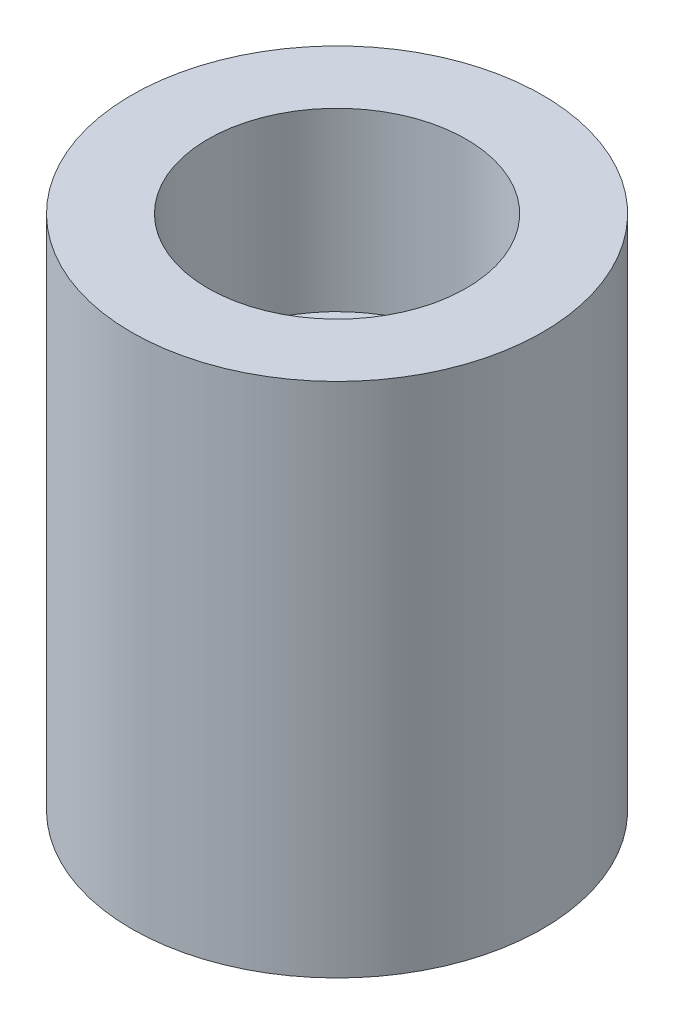
ISO-10303-21;
HEADER;
FILE_DESCRIPTION(('STEP AP214'),'2;1');
FILE_NAME('part.step','',(''),(''),'','','');
FILE_SCHEMA(('AUTOMOTIVE_DESIGN { 1 0 10303 214 1 1 1 1 }'));
ENDSEC;
DATA;
#1=APPLICATION_CONTEXT('core data for automotive mechanical design processes');
#2=APPLICATION_PROTOCOL_DEFINITION('international standard','automotive_design',2000,#1);
#3=PRODUCT_CONTEXT('',#1,'mechanical');
#4=PRODUCT('Part','Part','',(#3));
#5=PRODUCT_RELATED_PRODUCT_CATEGORY('part','',(#4));
#6=PRODUCT_DEFINITION_FORMATION('','',#4);
#7=PRODUCT_DEFINITION_CONTEXT('part definition',#1,'design');
#8=PRODUCT_DEFINITION('design','',#6,#7);
#9=PRODUCT_DEFINITION_SHAPE('','',#8);
#10=(LENGTH_UNIT() NAMED_UNIT(*) SI_UNIT(.MILLI.,.METRE.));
#11=(NAMED_UNIT(*) PLANE_ANGLE_UNIT() SI_UNIT($,.RADIAN.));
#12=(NAMED_UNIT(*) SI_UNIT($,.STERADIAN.) SOLID_ANGLE_UNIT());
#13=UNCERTAINTY_MEASURE_WITH_UNIT(LENGTH_MEASURE(1.E-05),#10,'distance_accuracy_value','');
#14=(GEOMETRIC_REPRESENTATION_CONTEXT(3) GLOBAL_UNCERTAINTY_ASSIGNED_CONTEXT((#13)) GLOBAL_UNIT_ASSIGNED_CONTEXT((#10,
#11,#12)) REPRESENTATION_CONTEXT('',''));
#15=CARTESIAN_POINT('',(0.,0.,0.));
#16=DIRECTION('',(0.,0.,1.));
#17=DIRECTION('',(1.,0.,0.));
#18=AXIS2_PLACEMENT_3D('',#15,#16,#17);
#19=CARTESIAN_POINT('',(0.,2.9,0.));
#20=DIRECTION('',(0.,-1.,0.));
#21=DIRECTION('',(0.,0.,-1.));
#22=AXIS2_PLACEMENT_3D('',#19,#20,#21);
#23=CYLINDRICAL_SURFACE('',#22,1.75);
#24=CARTESIAN_POINT('',(0.,0.,0.));
#25=DIRECTION('',(0.,1.,0.));
#26=DIRECTION('',(0.,0.,1.));
#27=AXIS2_PLACEMENT_3D('',#24,#25,#26);
#28=CIRCLE('',#27,1.75);
#29=CARTESIAN_POINT('',(0.,0.,1.75));
#30=VERTEX_POINT('',#29);
#31=EDGE_CURVE('E48',#30,#30,#28,.T.);
#32=ORIENTED_EDGE('',*,*,#31,.T.);
#33=EDGE_LOOP('',(#32));
#34=FACE_BOUND('',#33,.T.);
#35=CARTESIAN_POINT('',(0.,4.4,0.));
#36=DIRECTION('',(0.,1.,0.));
#37=DIRECTION('',(0.,0.,1.));
#38=AXIS2_PLACEMENT_3D('',#35,#36,#37);
#39=CIRCLE('',#38,1.75);
#40=CARTESIAN_POINT('',(0.,4.4,1.75));
#41=VERTEX_POINT('',#40);
#42=EDGE_CURVE('E55',#41,#41,#39,.T.);
#43=ORIENTED_EDGE('',*,*,#42,.F.);
#44=EDGE_LOOP('',(#43));
#45=FACE_BOUND('',#44,.T.);
#46=ADVANCED_FACE('F41',(#34,#45),#23,.T.);
#47=CARTESIAN_POINT('',(0.,0.,0.));
#48=DIRECTION('',(0.,1.,0.));
#49=DIRECTION('',(0.,0.,1.));
#50=AXIS2_PLACEMENT_3D('',#47,#48,#49);
#51=PLANE('',#50);
#52=ORIENTED_EDGE('',*,*,#31,.F.);
#53=EDGE_LOOP('',(#52));
#54=FACE_BOUND('',#53,.T.);
#55=ADVANCED_FACE('F69',(#54),#51,.F.);
#56=CARTESIAN_POINT('',(0.,4.4,0.));
#57=DIRECTION('',(0.,1.,0.));
#58=DIRECTION('',(0.,0.,1.));
#59=AXIS2_PLACEMENT_3D('',#56,#57,#58);
#60=PLANE('',#59);
#61=ORIENTED_EDGE('',*,*,#42,.T.);
#62=EDGE_LOOP('',(#61));
#63=FACE_BOUND('',#62,.T.);
#64=CARTESIAN_POINT('',(0.,4.4,0.));
#65=DIRECTION('',(0.,1.,0.));
#66=DIRECTION('',(0.,0.,1.));
#67=AXIS2_PLACEMENT_3D('',#64,#65,#66);
#68=CIRCLE('',#67,1.1);
#69=CARTESIAN_POINT('',(0.,4.4,1.1));
#70=VERTEX_POINT('',#69);
#71=EDGE_CURVE('E59',#70,#70,#68,.T.);
#72=ORIENTED_EDGE('',*,*,#71,.F.);
#73=EDGE_LOOP('',(#72));
#74=FACE_BOUND('',#73,.T.);
#75=ADVANCED_FACE('F67',(#63,#74),#60,.T.);
#76=CARTESIAN_POINT('',(0.,4.4,0.));
#77=DIRECTION('',(0.,-1.,0.));
#78=DIRECTION('',(0.,0.,-1.));
#79=AXIS2_PLACEMENT_3D('',#76,#77,#78);
#80=CYLINDRICAL_SURFACE('',#79,1.1);
#81=ORIENTED_EDGE('',*,*,#71,.T.);
#82=EDGE_LOOP('',(#81));
#83=FACE_BOUND('',#82,.T.);
#84=CARTESIAN_POINT('',(0.,2.9,0.));
#85=DIRECTION('',(0.,1.,0.));
#86=DIRECTION('',(0.,0.,1.));
#87=AXIS2_PLACEMENT_3D('',#84,#85,#86);
#88=CIRCLE('',#87,1.1);
#89=CARTESIAN_POINT('',(0.,2.9,1.1));
#90=VERTEX_POINT('',#89);
#91=EDGE_CURVE('E10',#90,#90,#88,.F.);
#92=ORIENTED_EDGE('',*,*,#91,.T.);
#93=EDGE_LOOP('',(#92));
#94=FACE_BOUND('',#93,.T.);
#95=ADVANCED_FACE('F65',(#83,#94),#80,.F.);
#96=CARTESIAN_POINT('',(0.,2.9,0.));
#97=DIRECTION('',(0.,1.,0.));
#98=DIRECTION('',(0.,0.,1.));
#99=AXIS2_PLACEMENT_3D('',#96,#97,#98);
#100=PLANE('',#99);
#101=ORIENTED_EDGE('',*,*,#91,.F.);
#102=EDGE_LOOP('',(#101));
#103=FACE_BOUND('',#102,.T.);
#104=ADVANCED_FACE('F76',(#103),#100,.T.);
#105=CLOSED_SHELL('',(#46,#55,#75,#95,#104));
#106=MANIFOLD_SOLID_BREP('B2',#105);
#107=ADVANCED_BREP_SHAPE_REPRESENTATION('',(#18,#106),#14);
#108=SHAPE_DEFINITION_REPRESENTATION(#9,#107);
ENDSEC;
END-ISO-10303-21;
